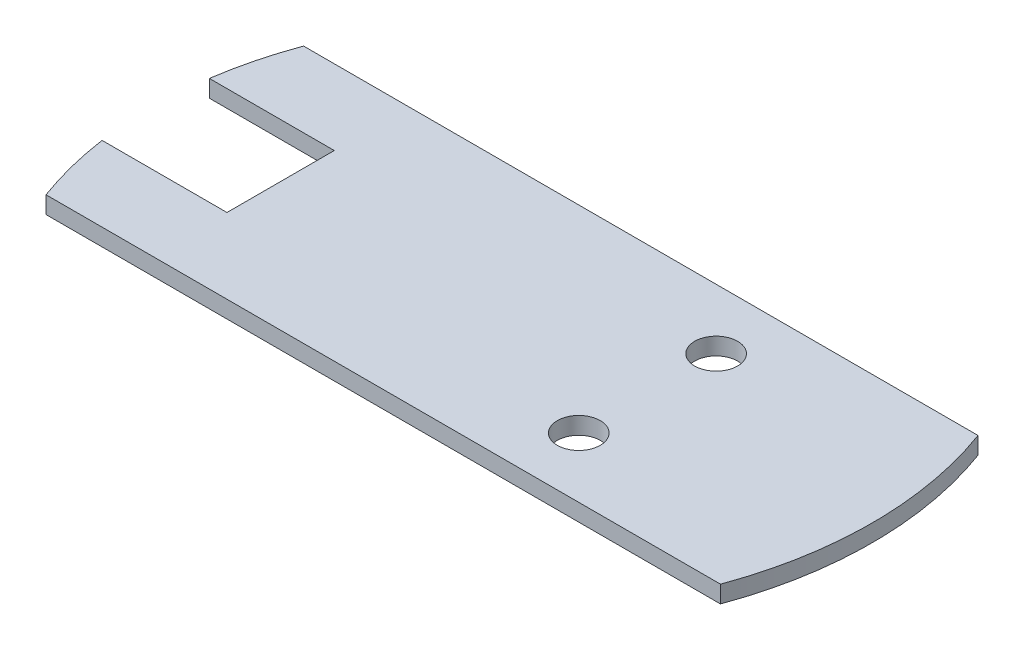
ISO-10303-21;
HEADER;
FILE_DESCRIPTION(('STEP AP214'),'2;1');
FILE_NAME('part.step','',(''),(''),'','','');
FILE_SCHEMA(('AUTOMOTIVE_DESIGN { 1 0 10303 214 1 1 1 1 }'));
ENDSEC;
DATA;
#1=APPLICATION_CONTEXT('core data for automotive mechanical design processes');
#2=APPLICATION_PROTOCOL_DEFINITION('international standard','automotive_design',2000,#1);
#3=PRODUCT_CONTEXT('',#1,'mechanical');
#4=PRODUCT('Part','Part','',(#3));
#5=PRODUCT_RELATED_PRODUCT_CATEGORY('part','',(#4));
#6=PRODUCT_DEFINITION_FORMATION('','',#4);
#7=PRODUCT_DEFINITION_CONTEXT('part definition',#1,'design');
#8=PRODUCT_DEFINITION('design','',#6,#7);
#9=PRODUCT_DEFINITION_SHAPE('','',#8);
#10=(LENGTH_UNIT() NAMED_UNIT(*) SI_UNIT(.MILLI.,.METRE.));
#11=(NAMED_UNIT(*) PLANE_ANGLE_UNIT() SI_UNIT($,.RADIAN.));
#12=(NAMED_UNIT(*) SI_UNIT($,.STERADIAN.) SOLID_ANGLE_UNIT());
#13=UNCERTAINTY_MEASURE_WITH_UNIT(LENGTH_MEASURE(1.E-05),#10,'distance_accuracy_value','');
#14=(GEOMETRIC_REPRESENTATION_CONTEXT(3) GLOBAL_UNCERTAINTY_ASSIGNED_CONTEXT((#13)) GLOBAL_UNIT_ASSIGNED_CONTEXT((#10,
#11,#12)) REPRESENTATION_CONTEXT('',''));
#15=CARTESIAN_POINT('',(0.,0.,0.));
#16=DIRECTION('',(0.,0.,1.));
#17=DIRECTION('',(1.,0.,0.));
#18=AXIS2_PLACEMENT_3D('',#15,#16,#17);
#19=CARTESIAN_POINT('',(1.5,1.,0.));
#20=DIRECTION('',(0.,-1.,0.));
#21=DIRECTION('',(0.,0.,-1.));
#22=AXIS2_PLACEMENT_3D('',#19,#20,#21);
#23=CYLINDRICAL_SURFACE('',#22,43.45);
#24=CARTESIAN_POINT('',(1.5,-1.,0.));
#25=DIRECTION('',(0.,1.,0.));
#26=DIRECTION('',(0.,0.,-1.));
#27=AXIS2_PLACEMENT_3D('',#24,#25,#26);
#28=CIRCLE('',#27,43.45);
#29=CARTESIAN_POINT('',(-39.2787015487252,-1.,-15.));
#30=VERTEX_POINT('',#29);
#31=CARTESIAN_POINT('',(-41.498139494634,-1.,-6.25));
#32=VERTEX_POINT('',#31);
#33=EDGE_CURVE('E132',#30,#32,#28,.T.);
#34=ORIENTED_EDGE('',*,*,#33,.T.);
#35=DIRECTION('',(0.,-1.,0.));
#36=VECTOR('',#35,1.);
#37=CARTESIAN_POINT('',(-41.498139494634,1.,-6.25));
#38=LINE('',#37,#36);
#39=CARTESIAN_POINT('',(-41.4981394946339,1.,-6.25));
#40=VERTEX_POINT('',#39);
#41=EDGE_CURVE('E116',#40,#32,#38,.T.);
#42=ORIENTED_EDGE('',*,*,#41,.F.);
#43=CARTESIAN_POINT('',(1.5,1.,0.));
#44=DIRECTION('',(0.,1.,0.));
#45=DIRECTION('',(0.,0.,-1.));
#46=AXIS2_PLACEMENT_3D('',#43,#44,#45);
#47=CIRCLE('',#46,43.45);
#48=CARTESIAN_POINT('',(-39.2787015487252,1.,-15.));
#49=VERTEX_POINT('',#48);
#50=EDGE_CURVE('E130',#49,#40,#47,.T.);
#51=ORIENTED_EDGE('',*,*,#50,.F.);
#52=DIRECTION('',(0.,-1.,0.));
#53=VECTOR('',#52,1.);
#54=CARTESIAN_POINT('',(-39.2787015487252,1.,-15.));
#55=LINE('',#54,#53);
#56=EDGE_CURVE('E47',#49,#30,#55,.T.);
#57=ORIENTED_EDGE('',*,*,#56,.T.);
#58=EDGE_LOOP('',(#34,#42,#51,#57));
#59=FACE_BOUND('',#58,.T.);
#60=ADVANCED_FACE('F38',(#59),#23,.T.);
#61=CARTESIAN_POINT('',(-1.5,1.,0.));
#62=DIRECTION('',(0.,-1.,0.));
#63=DIRECTION('',(0.,0.,-1.));
#64=AXIS2_PLACEMENT_3D('',#61,#62,#63);
#65=CYLINDRICAL_SURFACE('',#64,43.45);
#66=CARTESIAN_POINT('',(-1.5,-1.,0.));
#67=DIRECTION('',(0.,1.,0.));
#68=DIRECTION('',(0.,0.,1.));
#69=AXIS2_PLACEMENT_3D('',#66,#67,#68);
#70=CIRCLE('',#69,43.45);
#71=CARTESIAN_POINT('',(39.2787015487252,-1.,15.));
#72=VERTEX_POINT('',#71);
#73=CARTESIAN_POINT('',(39.2787015487252,-1.,-15.));
#74=VERTEX_POINT('',#73);
#75=EDGE_CURVE('E149',#72,#74,#70,.T.);
#76=ORIENTED_EDGE('',*,*,#75,.T.);
#77=DIRECTION('',(0.,-1.,0.));
#78=VECTOR('',#77,1.);
#79=CARTESIAN_POINT('',(39.2787015487252,1.,-15.));
#80=LINE('',#79,#78);
#81=CARTESIAN_POINT('',(39.2787015487252,1.,-15.));
#82=VERTEX_POINT('',#81);
#83=EDGE_CURVE('E11',#82,#74,#80,.T.);
#84=ORIENTED_EDGE('',*,*,#83,.F.);
#85=CARTESIAN_POINT('',(-1.5,1.,0.));
#86=DIRECTION('',(0.,1.,0.));
#87=DIRECTION('',(0.,0.,1.));
#88=AXIS2_PLACEMENT_3D('',#85,#86,#87);
#89=CIRCLE('',#88,43.45);
#90=CARTESIAN_POINT('',(39.2787015487252,1.,15.));
#91=VERTEX_POINT('',#90);
#92=EDGE_CURVE('E162',#91,#82,#89,.T.);
#93=ORIENTED_EDGE('',*,*,#92,.F.);
#94=DIRECTION('',(0.,-1.,0.));
#95=VECTOR('',#94,1.);
#96=CARTESIAN_POINT('',(39.2787015487252,1.,15.));
#97=LINE('',#96,#95);
#98=EDGE_CURVE('E143',#91,#72,#97,.T.);
#99=ORIENTED_EDGE('',*,*,#98,.T.);
#100=EDGE_LOOP('',(#76,#84,#93,#99));
#101=FACE_BOUND('',#100,.T.);
#102=ADVANCED_FACE('F40',(#101),#65,.T.);
#103=CARTESIAN_POINT('',(-39.2787015487252,1.,-15.));
#104=DIRECTION('',(0.,0.,1.));
#105=DIRECTION('',(1.,0.,0.));
#106=AXIS2_PLACEMENT_3D('',#103,#104,#105);
#107=PLANE('',#106);
#108=DIRECTION('',(-1.,0.,0.));
#109=VECTOR('',#108,1.);
#110=CARTESIAN_POINT('',(-39.2787015487252,-1.,-15.));
#111=LINE('',#110,#109);
#112=EDGE_CURVE('E153',#74,#30,#111,.T.);
#113=ORIENTED_EDGE('',*,*,#112,.T.);
#114=ORIENTED_EDGE('',*,*,#56,.F.);
#115=DIRECTION('',(-1.,0.,0.));
#116=VECTOR('',#115,1.);
#117=CARTESIAN_POINT('',(-39.2787015487252,1.,-15.));
#118=LINE('',#117,#116);
#119=EDGE_CURVE('E91',#82,#49,#118,.T.);
#120=ORIENTED_EDGE('',*,*,#119,.F.);
#121=ORIENTED_EDGE('',*,*,#83,.T.);
#122=EDGE_LOOP('',(#113,#114,#120,#121));
#123=FACE_BOUND('',#122,.T.);
#124=ADVANCED_FACE('F193',(#123),#107,.F.);
#125=CARTESIAN_POINT('',(-41.4981394946339,1.,6.25));
#126=VERTEX_POINT('',#125);
#127=CARTESIAN_POINT('',(-39.2787015487252,1.,15.));
#128=VERTEX_POINT('',#127);
#129=EDGE_CURVE('E138',#126,#128,#47,.T.);
#130=ORIENTED_EDGE('',*,*,#129,.F.);
#131=DIRECTION('',(0.,-1.,0.));
#132=VECTOR('',#131,1.);
#133=CARTESIAN_POINT('',(-41.4981394946339,1.,6.25));
#134=LINE('',#133,#132);
#135=CARTESIAN_POINT('',(-41.4981394946339,-1.,6.25));
#136=VERTEX_POINT('',#135);
#137=EDGE_CURVE('E134',#136,#126,#134,.F.);
#138=ORIENTED_EDGE('',*,*,#137,.F.);
#139=CARTESIAN_POINT('',(-39.2787015487252,-1.,15.));
#140=VERTEX_POINT('',#139);
#141=EDGE_CURVE('E157',#136,#140,#28,.T.);
#142=ORIENTED_EDGE('',*,*,#141,.T.);
#143=DIRECTION('',(0.,-1.,0.));
#144=VECTOR('',#143,1.);
#145=CARTESIAN_POINT('',(-39.2787015487252,1.,15.));
#146=LINE('',#145,#144);
#147=EDGE_CURVE('E165',#128,#140,#146,.T.);
#148=ORIENTED_EDGE('',*,*,#147,.F.);
#149=EDGE_LOOP('',(#130,#138,#142,#148));
#150=FACE_BOUND('',#149,.T.);
#151=ADVANCED_FACE('F195',(#150),#23,.T.);
#152=CARTESIAN_POINT('',(-39.2787015487252,1.,15.));
#153=DIRECTION('',(0.,0.,-1.));
#154=DIRECTION('',(-1.,0.,0.));
#155=AXIS2_PLACEMENT_3D('',#152,#153,#154);
#156=PLANE('',#155);
#157=DIRECTION('',(1.,0.,0.));
#158=VECTOR('',#157,1.);
#159=CARTESIAN_POINT('',(-39.2787015487252,-1.,15.));
#160=LINE('',#159,#158);
#161=EDGE_CURVE('E84',#140,#72,#160,.T.);
#162=ORIENTED_EDGE('',*,*,#161,.T.);
#163=ORIENTED_EDGE('',*,*,#98,.F.);
#164=DIRECTION('',(1.,0.,0.));
#165=VECTOR('',#164,1.);
#166=CARTESIAN_POINT('',(-39.2787015487252,1.,15.));
#167=LINE('',#166,#165);
#168=EDGE_CURVE('E63',#128,#91,#167,.T.);
#169=ORIENTED_EDGE('',*,*,#168,.F.);
#170=ORIENTED_EDGE('',*,*,#147,.T.);
#171=EDGE_LOOP('',(#162,#163,#169,#170));
#172=FACE_BOUND('',#171,.T.);
#173=ADVANCED_FACE('F200',(#172),#156,.F.);
#174=CARTESIAN_POINT('',(-1.5,1.,0.));
#175=DIRECTION('',(0.,1.,0.));
#176=DIRECTION('',(0.,0.,1.));
#177=AXIS2_PLACEMENT_3D('',#174,#175,#176);
#178=PLANE('',#177);
#179=CARTESIAN_POINT('',(15.7787015487252,1.,7.99999999999997));
#180=DIRECTION('',(0.,1.,0.));
#181=DIRECTION('',(0.,0.,1.));
#182=AXIS2_PLACEMENT_3D('',#179,#180,#181);
#183=CIRCLE('',#182,2.49999999999999);
#184=CARTESIAN_POINT('',(15.7787015487252,1.,10.5));
#185=VERTEX_POINT('',#184);
#186=EDGE_CURVE('E236',#185,#185,#183,.F.);
#187=ORIENTED_EDGE('',*,*,#186,.T.);
#188=EDGE_LOOP('',(#187));
#189=FACE_BOUND('',#188,.T.);
#190=CARTESIAN_POINT('',(15.7787015487252,1.,-8.00000000000001));
#191=DIRECTION('',(0.,1.,0.));
#192=DIRECTION('',(0.,0.,1.));
#193=AXIS2_PLACEMENT_3D('',#190,#191,#192);
#194=CIRCLE('',#193,2.5);
#195=CARTESIAN_POINT('',(15.7787015487252,1.,-5.50000000000002));
#196=VERTEX_POINT('',#195);
#197=EDGE_CURVE('E250',#196,#196,#194,.F.);
#198=ORIENTED_EDGE('',*,*,#197,.T.);
#199=EDGE_LOOP('',(#198));
#200=FACE_BOUND('',#199,.T.);
#201=DIRECTION('',(-1.,0.,0.));
#202=VECTOR('',#201,1.);
#203=CARTESIAN_POINT('',(-26.95,1.,-6.25));
#204=LINE('',#203,#202);
#205=CARTESIAN_POINT('',(-26.95,1.,-6.25));
#206=VERTEX_POINT('',#205);
#207=EDGE_CURVE('E112',#206,#40,#204,.T.);
#208=ORIENTED_EDGE('',*,*,#207,.F.);
#209=DIRECTION('',(0.,0.,-1.));
#210=VECTOR('',#209,1.);
#211=CARTESIAN_POINT('',(-26.95,1.,6.25));
#212=LINE('',#211,#210);
#213=CARTESIAN_POINT('',(-26.95,1.,6.25));
#214=VERTEX_POINT('',#213);
#215=EDGE_CURVE('E124',#214,#206,#212,.T.);
#216=ORIENTED_EDGE('',*,*,#215,.F.);
#217=DIRECTION('',(1.,0.,0.));
#218=VECTOR('',#217,1.);
#219=CARTESIAN_POINT('',(-26.95,1.,6.25));
#220=LINE('',#219,#218);
#221=EDGE_CURVE('E175',#126,#214,#220,.T.);
#222=ORIENTED_EDGE('',*,*,#221,.F.);
#223=ORIENTED_EDGE('',*,*,#129,.T.);
#224=ORIENTED_EDGE('',*,*,#168,.T.);
#225=ORIENTED_EDGE('',*,*,#92,.T.);
#226=ORIENTED_EDGE('',*,*,#119,.T.);
#227=ORIENTED_EDGE('',*,*,#50,.T.);
#228=EDGE_LOOP('',(#208,#216,#222,#223,#224,#225,#226,#227));
#229=FACE_BOUND('',#228,.T.);
#230=ADVANCED_FACE('F136',(#189,#200,#229),#178,.T.);
#231=CARTESIAN_POINT('',(-1.5,-1.,0.));
#232=DIRECTION('',(0.,1.,0.));
#233=DIRECTION('',(0.,0.,1.));
#234=AXIS2_PLACEMENT_3D('',#231,#232,#233);
#235=PLANE('',#234);
#236=CARTESIAN_POINT('',(15.7787015487252,-1.,7.99999999999997));
#237=DIRECTION('',(0.,-1.,0.));
#238=DIRECTION('',(0.,0.,-1.));
#239=AXIS2_PLACEMENT_3D('',#236,#237,#238);
#240=CIRCLE('',#239,2.49999999999999);
#241=CARTESIAN_POINT('',(15.7787015487252,-1.,5.49999999999997));
#242=VERTEX_POINT('',#241);
#243=EDGE_CURVE('E239',#242,#242,#240,.T.);
#244=ORIENTED_EDGE('',*,*,#243,.F.);
#245=EDGE_LOOP('',(#244));
#246=FACE_BOUND('',#245,.T.);
#247=CARTESIAN_POINT('',(15.7787015487252,-1.,-8.00000000000001));
#248=DIRECTION('',(0.,-1.,0.));
#249=DIRECTION('',(0.,0.,-1.));
#250=AXIS2_PLACEMENT_3D('',#247,#248,#249);
#251=CIRCLE('',#250,2.5);
#252=CARTESIAN_POINT('',(15.7787015487252,-1.,-10.5));
#253=VERTEX_POINT('',#252);
#254=EDGE_CURVE('E245',#253,#253,#251,.T.);
#255=ORIENTED_EDGE('',*,*,#254,.F.);
#256=EDGE_LOOP('',(#255));
#257=FACE_BOUND('',#256,.T.);
#258=DIRECTION('',(0.,0.,1.));
#259=VECTOR('',#258,1.);
#260=CARTESIAN_POINT('',(-26.95,-1.,6.25));
#261=LINE('',#260,#259);
#262=CARTESIAN_POINT('',(-26.95,-1.,-6.25));
#263=VERTEX_POINT('',#262);
#264=CARTESIAN_POINT('',(-26.95,-1.,6.25));
#265=VERTEX_POINT('',#264);
#266=EDGE_CURVE('E54',#263,#265,#261,.T.);
#267=ORIENTED_EDGE('',*,*,#266,.F.);
#268=DIRECTION('',(1.,0.,0.));
#269=VECTOR('',#268,1.);
#270=CARTESIAN_POINT('',(-26.95,-1.,-6.25));
#271=LINE('',#270,#269);
#272=EDGE_CURVE('E173',#32,#263,#271,.T.);
#273=ORIENTED_EDGE('',*,*,#272,.F.);
#274=ORIENTED_EDGE('',*,*,#33,.F.);
#275=ORIENTED_EDGE('',*,*,#112,.F.);
#276=ORIENTED_EDGE('',*,*,#75,.F.);
#277=ORIENTED_EDGE('',*,*,#161,.F.);
#278=ORIENTED_EDGE('',*,*,#141,.F.);
#279=DIRECTION('',(-1.,0.,0.));
#280=VECTOR('',#279,1.);
#281=CARTESIAN_POINT('',(-26.95,-1.,6.25));
#282=LINE('',#281,#280);
#283=EDGE_CURVE('E154',#265,#136,#282,.T.);
#284=ORIENTED_EDGE('',*,*,#283,.F.);
#285=EDGE_LOOP('',(#267,#273,#274,#275,#276,#277,#278,#284));
#286=FACE_BOUND('',#285,.T.);
#287=ADVANCED_FACE('F171',(#246,#257,#286),#235,.F.);
#288=CARTESIAN_POINT('',(-26.95,-1.001,-6.25));
#289=DIRECTION('',(0.,0.,-1.));
#290=DIRECTION('',(-1.,0.,0.));
#291=AXIS2_PLACEMENT_3D('',#288,#289,#290);
#292=PLANE('',#291);
#293=ORIENTED_EDGE('',*,*,#41,.T.);
#294=ORIENTED_EDGE('',*,*,#272,.T.);
#295=DIRECTION('',(0.,1.,0.));
#296=VECTOR('',#295,1.);
#297=CARTESIAN_POINT('',(-26.95,-1.001,-6.25));
#298=LINE('',#297,#296);
#299=EDGE_CURVE('E118',#263,#206,#298,.T.);
#300=ORIENTED_EDGE('',*,*,#299,.T.);
#301=ORIENTED_EDGE('',*,*,#207,.T.);
#302=EDGE_LOOP('',(#293,#294,#300,#301));
#303=FACE_BOUND('',#302,.T.);
#304=ADVANCED_FACE('F114',(#303),#292,.F.);
#305=CARTESIAN_POINT('',(-26.95,-1.001,6.25));
#306=DIRECTION('',(1.,0.,0.));
#307=DIRECTION('',(0.,0.,-1.));
#308=AXIS2_PLACEMENT_3D('',#305,#306,#307);
#309=PLANE('',#308);
#310=ORIENTED_EDGE('',*,*,#266,.T.);
#311=DIRECTION('',(0.,1.,0.));
#312=VECTOR('',#311,1.);
#313=CARTESIAN_POINT('',(-26.95,-1.001,6.25));
#314=LINE('',#313,#312);
#315=EDGE_CURVE('E123',#265,#214,#314,.T.);
#316=ORIENTED_EDGE('',*,*,#315,.T.);
#317=ORIENTED_EDGE('',*,*,#215,.T.);
#318=ORIENTED_EDGE('',*,*,#299,.F.);
#319=EDGE_LOOP('',(#310,#316,#317,#318));
#320=FACE_BOUND('',#319,.T.);
#321=ADVANCED_FACE('F219',(#320),#309,.F.);
#322=CARTESIAN_POINT('',(-26.95,-1.001,6.25));
#323=DIRECTION('',(0.,0.,1.));
#324=DIRECTION('',(1.,0.,0.));
#325=AXIS2_PLACEMENT_3D('',#322,#323,#324);
#326=PLANE('',#325);
#327=ORIENTED_EDGE('',*,*,#137,.T.);
#328=ORIENTED_EDGE('',*,*,#221,.T.);
#329=ORIENTED_EDGE('',*,*,#315,.F.);
#330=ORIENTED_EDGE('',*,*,#283,.T.);
#331=EDGE_LOOP('',(#327,#328,#329,#330));
#332=FACE_BOUND('',#331,.T.);
#333=ADVANCED_FACE('F215',(#332),#326,.F.);
#334=CARTESIAN_POINT('',(15.7787015487252,1.001,-8.00000000000001));
#335=DIRECTION('',(0.,-1.,0.));
#336=DIRECTION('',(0.,0.,-1.));
#337=AXIS2_PLACEMENT_3D('',#334,#335,#336);
#338=CYLINDRICAL_SURFACE('',#337,2.5);
#339=ORIENTED_EDGE('',*,*,#197,.F.);
#340=EDGE_LOOP('',(#339));
#341=FACE_BOUND('',#340,.T.);
#342=ORIENTED_EDGE('',*,*,#254,.T.);
#343=EDGE_LOOP('',(#342));
#344=FACE_BOUND('',#343,.T.);
#345=ADVANCED_FACE('F218',(#341,#344),#338,.F.);
#346=CARTESIAN_POINT('',(15.7787015487252,1.001,7.99999999999997));
#347=DIRECTION('',(0.,-1.,0.));
#348=DIRECTION('',(0.,0.,-1.));
#349=AXIS2_PLACEMENT_3D('',#346,#347,#348);
#350=CYLINDRICAL_SURFACE('',#349,2.49999999999999);
#351=ORIENTED_EDGE('',*,*,#186,.F.);
#352=EDGE_LOOP('',(#351));
#353=FACE_BOUND('',#352,.T.);
#354=ORIENTED_EDGE('',*,*,#243,.T.);
#355=EDGE_LOOP('',(#354));
#356=FACE_BOUND('',#355,.T.);
#357=ADVANCED_FACE('F227',(#353,#356),#350,.F.);
#358=CLOSED_SHELL('',(#60,#102,#124,#151,#173,#230,#287,#304,#321,#333,#345,#357));
#359=MANIFOLD_SOLID_BREP('B2',#358);
#360=ADVANCED_BREP_SHAPE_REPRESENTATION('',(#18,#359),#14);
#361=SHAPE_DEFINITION_REPRESENTATION(#9,#360);
ENDSEC;
END-ISO-10303-21;
